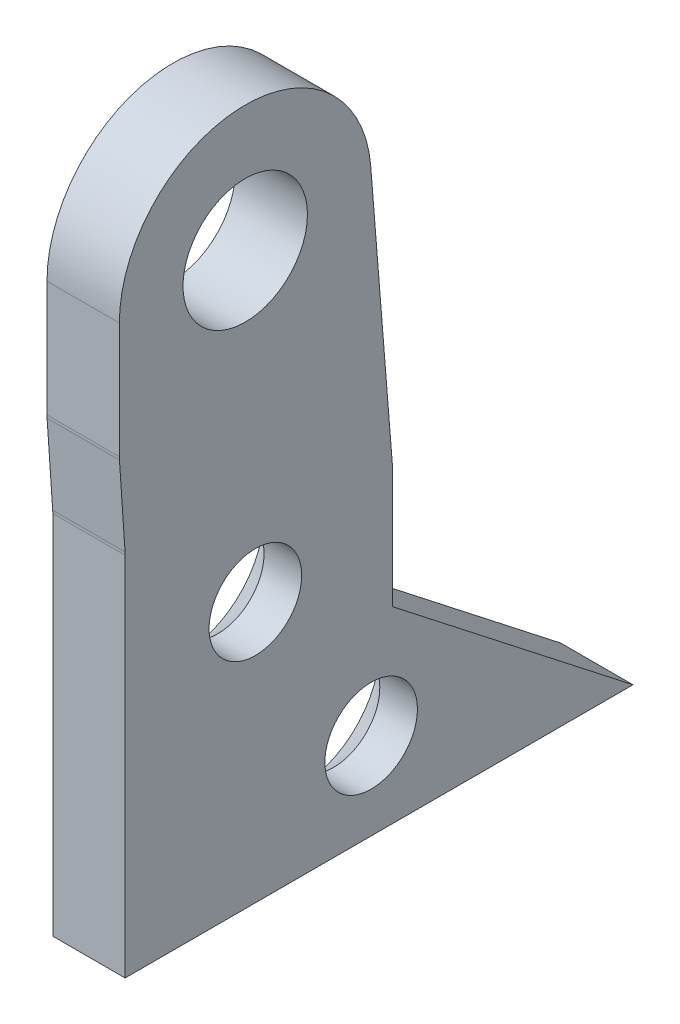
ISO-10303-21;
HEADER;
FILE_DESCRIPTION(('STEP AP214'),'2;1');
FILE_NAME('part.step','',(''),(''),'','','');
FILE_SCHEMA(('AUTOMOTIVE_DESIGN { 1 0 10303 214 1 1 1 1 }'));
ENDSEC;
DATA;
#1=APPLICATION_CONTEXT('core data for automotive mechanical design processes');
#2=APPLICATION_PROTOCOL_DEFINITION('international standard','automotive_design',2000,#1);
#3=PRODUCT_CONTEXT('',#1,'mechanical');
#4=PRODUCT('Part','Part','',(#3));
#5=PRODUCT_RELATED_PRODUCT_CATEGORY('part','',(#4));
#6=PRODUCT_DEFINITION_FORMATION('','',#4);
#7=PRODUCT_DEFINITION_CONTEXT('part definition',#1,'design');
#8=PRODUCT_DEFINITION('design','',#6,#7);
#9=PRODUCT_DEFINITION_SHAPE('','',#8);
#10=(LENGTH_UNIT() NAMED_UNIT(*) SI_UNIT(.MILLI.,.METRE.));
#11=(NAMED_UNIT(*) PLANE_ANGLE_UNIT() SI_UNIT($,.RADIAN.));
#12=(NAMED_UNIT(*) SI_UNIT($,.STERADIAN.) SOLID_ANGLE_UNIT());
#13=UNCERTAINTY_MEASURE_WITH_UNIT(LENGTH_MEASURE(1.E-05),#10,'distance_accuracy_value','');
#14=(GEOMETRIC_REPRESENTATION_CONTEXT(3) GLOBAL_UNCERTAINTY_ASSIGNED_CONTEXT((#13)) GLOBAL_UNIT_ASSIGNED_CONTEXT((#10,
#11,#12)) REPRESENTATION_CONTEXT('',''));
#15=CARTESIAN_POINT('',(0.,0.,0.));
#16=DIRECTION('',(0.,0.,1.));
#17=DIRECTION('',(1.,0.,0.));
#18=AXIS2_PLACEMENT_3D('',#15,#16,#17);
#19=CARTESIAN_POINT('',(-1.25,0.,0.));
#20=DIRECTION('',(-1.,0.,0.));
#21=DIRECTION('',(0.,0.,-1.));
#22=AXIS2_PLACEMENT_3D('',#19,#20,#21);
#23=PLANE('',#22);
#24=CARTESIAN_POINT('',(-1.25,-16.7,-4.35));
#25=DIRECTION('',(1.,0.,0.));
#26=DIRECTION('',(0.,0.,-1.));
#27=AXIS2_PLACEMENT_3D('',#24,#25,#26);
#28=CIRCLE('',#27,2.80000000000001);
#29=CARTESIAN_POINT('',(-1.25,-16.7,-7.15000000000001));
#30=VERTEX_POINT('',#29);
#31=EDGE_CURVE('E45',#30,#30,#28,.F.);
#32=ORIENTED_EDGE('',*,*,#31,.F.);
#33=EDGE_LOOP('',(#32));
#34=FACE_BOUND('',#33,.T.);
#35=CARTESIAN_POINT('',(-1.25,-10.7,-0.35));
#36=DIRECTION('',(1.,0.,0.));
#37=DIRECTION('',(0.,0.,-1.));
#38=AXIS2_PLACEMENT_3D('',#35,#36,#37);
#39=CIRCLE('',#38,2.80000000000001);
#40=CARTESIAN_POINT('',(-1.25,-10.7,-3.15000000000001));
#41=VERTEX_POINT('',#40);
#42=EDGE_CURVE('E166',#41,#41,#39,.F.);
#43=ORIENTED_EDGE('',*,*,#42,.F.);
#44=EDGE_LOOP('',(#43));
#45=FACE_BOUND('',#44,.T.);
#46=DIRECTION('',(0.,0.,1.));
#47=VECTOR('',#46,1.);
#48=CARTESIAN_POINT('',(-1.25,-19.7,4.15));
#49=LINE('',#48,#47);
#50=CARTESIAN_POINT('',(-1.25,-19.7,-13.3978945611621));
#51=VERTEX_POINT('',#50);
#52=CARTESIAN_POINT('',(-1.25,-19.7,4.15));
#53=VERTEX_POINT('',#52);
#54=EDGE_CURVE('E206',#51,#53,#49,.T.);
#55=ORIENTED_EDGE('',*,*,#54,.T.);
#56=DIRECTION('',(0.,-1.,0.));
#57=VECTOR('',#56,1.);
#58=CARTESIAN_POINT('',(-1.25,-7.05080295932135,4.15));
#59=LINE('',#58,#57);
#60=CARTESIAN_POINT('',(-1.25,-7.05080295932135,4.15));
#61=VERTEX_POINT('',#60);
#62=EDGE_CURVE('E130',#61,#53,#59,.T.);
#63=ORIENTED_EDGE('',*,*,#62,.F.);
#64=CARTESIAN_POINT('',(-1.25,-7.05080295932135,5.65));
#65=DIRECTION('',(-1.,0.,0.));
#66=DIRECTION('',(0.,0.,-1.));
#67=AXIS2_PLACEMENT_3D('',#64,#65,#66);
#68=CIRCLE('',#67,1.5);
#69=CARTESIAN_POINT('',(-1.25,-6.94931345773765,4.153437311347));
#70=VERTEX_POINT('',#69);
#71=EDGE_CURVE('E109',#70,#61,#68,.T.);
#72=ORIENTED_EDGE('',*,*,#71,.F.);
#73=DIRECTION('',(0.,-0.997708459101999,-0.0676596677224669));
#74=VECTOR('',#73,1.);
#75=CARTESIAN_POINT('',(-1.25,-4.1014895015837,4.346562688653));
#76=LINE('',#75,#74);
#77=CARTESIAN_POINT('',(-1.25,-4.1014895015837,4.346562688653));
#78=VERTEX_POINT('',#77);
#79=EDGE_CURVE('E120',#78,#70,#76,.T.);
#80=ORIENTED_EDGE('',*,*,#79,.F.);
#81=CARTESIAN_POINT('',(-1.25,-4.,2.85));
#82=DIRECTION('',(1.,0.,0.));
#83=DIRECTION('',(0.,0.,-1.));
#84=AXIS2_PLACEMENT_3D('',#81,#82,#83);
#85=CIRCLE('',#84,1.5);
#86=CARTESIAN_POINT('',(-1.25,-4.,4.35));
#87=VERTEX_POINT('',#86);
#88=EDGE_CURVE('E125',#87,#78,#85,.T.);
#89=ORIENTED_EDGE('',*,*,#88,.F.);
#90=DIRECTION('',(0.,-1.,0.));
#91=VECTOR('',#90,1.);
#92=CARTESIAN_POINT('',(-1.25,0.,4.35));
#93=LINE('',#92,#91);
#94=CARTESIAN_POINT('',(-1.25,0.,4.35));
#95=VERTEX_POINT('',#94);
#96=EDGE_CURVE('E231',#95,#87,#93,.T.);
#97=ORIENTED_EDGE('',*,*,#96,.F.);
#98=CARTESIAN_POINT('',(-1.25,0.,0.));
#99=DIRECTION('',(1.,0.,0.));
#100=DIRECTION('',(0.,0.,-1.));
#101=AXIS2_PLACEMENT_3D('',#98,#99,#100);
#102=CIRCLE('',#101,4.35);
#103=CARTESIAN_POINT('',(-1.25,0.348531342054637,-4.33601497963344));
#104=VERTEX_POINT('',#103);
#105=EDGE_CURVE('E156',#104,#95,#102,.T.);
#106=ORIENTED_EDGE('',*,*,#105,.F.);
#107=DIRECTION('',(0.,0.996785052789297,0.0801221475987673));
#108=VECTOR('',#107,1.);
#109=CARTESIAN_POINT('',(-1.25,-12.8120622960922,-5.39387095671929));
#110=LINE('',#109,#108);
#111=CARTESIAN_POINT('',(-1.25,-8.98239612653322,-5.08604021905647));
#112=VERTEX_POINT('',#111);
#113=EDGE_CURVE('E132',#112,#104,#110,.T.);
#114=ORIENTED_EDGE('',*,*,#113,.F.);
#115=DIRECTION('',(0.,-1.,0.));
#116=VECTOR('',#115,1.);
#117=CARTESIAN_POINT('',(-1.25,-13.2060676728955,-5.08604021905647));
#118=LINE('',#117,#116);
#119=CARTESIAN_POINT('',(-1.25,-13.2060676728955,-5.08604021905647));
#120=VERTEX_POINT('',#119);
#121=EDGE_CURVE('E194',#112,#120,#118,.T.);
#122=ORIENTED_EDGE('',*,*,#121,.T.);
#123=DIRECTION('',(0.,-0.615661475325654,-0.788010753606726));
#124=VECTOR('',#123,1.);
#125=CARTESIAN_POINT('',(-1.25,-19.7,-13.3978945611621));
#126=LINE('',#125,#124);
#127=EDGE_CURVE('E198',#120,#51,#126,.T.);
#128=ORIENTED_EDGE('',*,*,#127,.T.);
#129=EDGE_LOOP('',(#55,#63,#72,#80,#89,#97,#106,#114,#122,#128));
#130=FACE_BOUND('',#129,.T.);
#131=CARTESIAN_POINT('',(-1.25,0.,0.));
#132=DIRECTION('',(1.,0.,0.));
#133=DIRECTION('',(0.,0.,-1.));
#134=AXIS2_PLACEMENT_3D('',#131,#132,#133);
#135=CIRCLE('',#134,2.15);
#136=CARTESIAN_POINT('',(-1.25,0.,-2.15));
#137=VERTEX_POINT('',#136);
#138=EDGE_CURVE('E141',#137,#137,#135,.T.);
#139=ORIENTED_EDGE('',*,*,#138,.T.);
#140=EDGE_LOOP('',(#139));
#141=FACE_BOUND('',#140,.T.);
#142=ADVANCED_FACE('F37',(#34,#45,#130,#141),#23,.T.);
#143=CARTESIAN_POINT('',(1.25,0.,0.));
#144=DIRECTION('',(-1.,0.,0.));
#145=DIRECTION('',(0.,0.,-1.));
#146=AXIS2_PLACEMENT_3D('',#143,#144,#145);
#147=PLANE('',#146);
#148=CARTESIAN_POINT('',(1.25,-16.7,-4.35));
#149=DIRECTION('',(1.,0.,0.));
#150=DIRECTION('',(0.,0.,-1.));
#151=AXIS2_PLACEMENT_3D('',#148,#149,#150);
#152=CIRCLE('',#151,1.6);
#153=CARTESIAN_POINT('',(1.25,-16.7,-5.95));
#154=VERTEX_POINT('',#153);
#155=EDGE_CURVE('E195',#154,#154,#152,.T.);
#156=ORIENTED_EDGE('',*,*,#155,.F.);
#157=EDGE_LOOP('',(#156));
#158=FACE_BOUND('',#157,.T.);
#159=CARTESIAN_POINT('',(1.25,-10.7,-0.35));
#160=DIRECTION('',(1.,0.,0.));
#161=DIRECTION('',(0.,0.,-1.));
#162=AXIS2_PLACEMENT_3D('',#159,#160,#161);
#163=CIRCLE('',#162,1.6);
#164=CARTESIAN_POINT('',(1.25,-10.7,-1.95));
#165=VERTEX_POINT('',#164);
#166=EDGE_CURVE('E192',#165,#165,#163,.T.);
#167=ORIENTED_EDGE('',*,*,#166,.F.);
#168=EDGE_LOOP('',(#167));
#169=FACE_BOUND('',#168,.T.);
#170=DIRECTION('',(0.,-0.615661475325654,-0.788010753606726));
#171=VECTOR('',#170,1.);
#172=CARTESIAN_POINT('',(1.25,-19.7,-13.3978945611621));
#173=LINE('',#172,#171);
#174=CARTESIAN_POINT('',(1.25,-13.2060676728955,-5.08604021905647));
#175=VERTEX_POINT('',#174);
#176=CARTESIAN_POINT('',(1.25,-19.7,-13.3978945611621));
#177=VERTEX_POINT('',#176);
#178=EDGE_CURVE('E205',#175,#177,#173,.T.);
#179=ORIENTED_EDGE('',*,*,#178,.F.);
#180=DIRECTION('',(0.,-1.,0.));
#181=VECTOR('',#180,1.);
#182=CARTESIAN_POINT('',(1.25,-13.2060676728955,-5.08604021905647));
#183=LINE('',#182,#181);
#184=CARTESIAN_POINT('',(1.25,-8.98239612653322,-5.08604021905647));
#185=VERTEX_POINT('',#184);
#186=EDGE_CURVE('E203',#185,#175,#183,.T.);
#187=ORIENTED_EDGE('',*,*,#186,.F.);
#188=DIRECTION('',(0.,0.996785052789297,0.0801221475987673));
#189=VECTOR('',#188,1.);
#190=CARTESIAN_POINT('',(1.25,-12.8120622960922,-5.39387095671929));
#191=LINE('',#190,#189);
#192=CARTESIAN_POINT('',(1.25,0.348531342054637,-4.33601497963344));
#193=VERTEX_POINT('',#192);
#194=EDGE_CURVE('E153',#185,#193,#191,.T.);
#195=ORIENTED_EDGE('',*,*,#194,.T.);
#196=CARTESIAN_POINT('',(1.25,0.,0.));
#197=DIRECTION('',(1.,0.,0.));
#198=DIRECTION('',(0.,0.,-1.));
#199=AXIS2_PLACEMENT_3D('',#196,#197,#198);
#200=CIRCLE('',#199,4.35);
#201=CARTESIAN_POINT('',(1.25,0.,4.35));
#202=VERTEX_POINT('',#201);
#203=EDGE_CURVE('E137',#193,#202,#200,.T.);
#204=ORIENTED_EDGE('',*,*,#203,.T.);
#205=DIRECTION('',(0.,-1.,0.));
#206=VECTOR('',#205,1.);
#207=CARTESIAN_POINT('',(1.25,0.,4.35));
#208=LINE('',#207,#206);
#209=CARTESIAN_POINT('',(1.25,-4.,4.35));
#210=VERTEX_POINT('',#209);
#211=EDGE_CURVE('E140',#202,#210,#208,.T.);
#212=ORIENTED_EDGE('',*,*,#211,.T.);
#213=CARTESIAN_POINT('',(1.25,-4.,2.85));
#214=DIRECTION('',(1.,0.,0.));
#215=DIRECTION('',(0.,0.,-1.));
#216=AXIS2_PLACEMENT_3D('',#213,#214,#215);
#217=CIRCLE('',#216,1.5);
#218=CARTESIAN_POINT('',(1.25,-4.1014895015837,4.346562688653));
#219=VERTEX_POINT('',#218);
#220=EDGE_CURVE('E144',#210,#219,#217,.T.);
#221=ORIENTED_EDGE('',*,*,#220,.T.);
#222=DIRECTION('',(0.,-0.997708459101999,-0.0676596677224669));
#223=VECTOR('',#222,1.);
#224=CARTESIAN_POINT('',(1.25,-4.1014895015837,4.346562688653));
#225=LINE('',#224,#223);
#226=CARTESIAN_POINT('',(1.25,-6.94931345773765,4.153437311347));
#227=VERTEX_POINT('',#226);
#228=EDGE_CURVE('E147',#219,#227,#225,.T.);
#229=ORIENTED_EDGE('',*,*,#228,.T.);
#230=CARTESIAN_POINT('',(1.25,-7.05080295932135,5.65));
#231=DIRECTION('',(-1.,0.,0.));
#232=DIRECTION('',(0.,0.,-1.));
#233=AXIS2_PLACEMENT_3D('',#230,#231,#232);
#234=CIRCLE('',#233,1.5);
#235=CARTESIAN_POINT('',(1.25,-7.05080295932135,4.15));
#236=VERTEX_POINT('',#235);
#237=EDGE_CURVE('E112',#227,#236,#234,.T.);
#238=ORIENTED_EDGE('',*,*,#237,.T.);
#239=DIRECTION('',(0.,-1.,0.));
#240=VECTOR('',#239,1.);
#241=CARTESIAN_POINT('',(1.25,-7.05080295932135,4.15));
#242=LINE('',#241,#240);
#243=CARTESIAN_POINT('',(1.25,-19.7,4.15));
#244=VERTEX_POINT('',#243);
#245=EDGE_CURVE('E150',#236,#244,#242,.T.);
#246=ORIENTED_EDGE('',*,*,#245,.T.);
#247=DIRECTION('',(0.,0.,1.));
#248=VECTOR('',#247,1.);
#249=CARTESIAN_POINT('',(1.25,-19.7,4.15));
#250=LINE('',#249,#248);
#251=EDGE_CURVE('E209',#177,#244,#250,.T.);
#252=ORIENTED_EDGE('',*,*,#251,.F.);
#253=EDGE_LOOP('',(#179,#187,#195,#204,#212,#221,#229,#238,#246,#252));
#254=FACE_BOUND('',#253,.T.);
#255=CARTESIAN_POINT('',(1.25,0.,0.));
#256=DIRECTION('',(1.,0.,0.));
#257=DIRECTION('',(0.,0.,-1.));
#258=AXIS2_PLACEMENT_3D('',#255,#256,#257);
#259=CIRCLE('',#258,2.15);
#260=CARTESIAN_POINT('',(1.25,0.,-2.15));
#261=VERTEX_POINT('',#260);
#262=EDGE_CURVE('E218',#261,#261,#259,.T.);
#263=ORIENTED_EDGE('',*,*,#262,.F.);
#264=EDGE_LOOP('',(#263));
#265=FACE_BOUND('',#264,.T.);
#266=ADVANCED_FACE('F176',(#158,#169,#254,#265),#147,.F.);
#267=CARTESIAN_POINT('',(-1.25,0.,0.));
#268=DIRECTION('',(1.,0.,0.));
#269=DIRECTION('',(0.,0.,1.));
#270=AXIS2_PLACEMENT_3D('',#267,#268,#269);
#271=CYLINDRICAL_SURFACE('',#270,4.35);
#272=ORIENTED_EDGE('',*,*,#203,.F.);
#273=DIRECTION('',(1.,0.,0.));
#274=VECTOR('',#273,1.);
#275=CARTESIAN_POINT('',(-1.25,0.348531342054637,-4.33601497963344));
#276=LINE('',#275,#274);
#277=EDGE_CURVE('E61',#104,#193,#276,.T.);
#278=ORIENTED_EDGE('',*,*,#277,.F.);
#279=ORIENTED_EDGE('',*,*,#105,.T.);
#280=DIRECTION('',(1.,0.,0.));
#281=VECTOR('',#280,1.);
#282=CARTESIAN_POINT('',(-1.25,0.,4.35));
#283=LINE('',#282,#281);
#284=EDGE_CURVE('E92',#95,#202,#283,.T.);
#285=ORIENTED_EDGE('',*,*,#284,.T.);
#286=EDGE_LOOP('',(#272,#278,#279,#285));
#287=FACE_BOUND('',#286,.T.);
#288=ADVANCED_FACE('F243',(#287),#271,.T.);
#289=CARTESIAN_POINT('',(-1.25,0.,4.35));
#290=DIRECTION('',(0.,0.,-1.));
#291=DIRECTION('',(0.,1.,0.));
#292=AXIS2_PLACEMENT_3D('',#289,#290,#291);
#293=PLANE('',#292);
#294=ORIENTED_EDGE('',*,*,#211,.F.);
#295=ORIENTED_EDGE('',*,*,#284,.F.);
#296=ORIENTED_EDGE('',*,*,#96,.T.);
#297=DIRECTION('',(1.,0.,0.));
#298=VECTOR('',#297,1.);
#299=CARTESIAN_POINT('',(-1.25,-4.,4.35));
#300=LINE('',#299,#298);
#301=EDGE_CURVE('E160',#87,#210,#300,.T.);
#302=ORIENTED_EDGE('',*,*,#301,.T.);
#303=EDGE_LOOP('',(#294,#295,#296,#302));
#304=FACE_BOUND('',#303,.T.);
#305=ADVANCED_FACE('F238',(#304),#293,.F.);
#306=CARTESIAN_POINT('',(-1.25,-4.,2.85));
#307=DIRECTION('',(1.,0.,0.));
#308=DIRECTION('',(0.,0.,1.));
#309=AXIS2_PLACEMENT_3D('',#306,#307,#308);
#310=CYLINDRICAL_SURFACE('',#309,1.5);
#311=ORIENTED_EDGE('',*,*,#220,.F.);
#312=ORIENTED_EDGE('',*,*,#301,.F.);
#313=ORIENTED_EDGE('',*,*,#88,.T.);
#314=DIRECTION('',(1.,0.,0.));
#315=VECTOR('',#314,1.);
#316=CARTESIAN_POINT('',(-1.25,-4.1014895015837,4.346562688653));
#317=LINE('',#316,#315);
#318=EDGE_CURVE('E116',#78,#219,#317,.T.);
#319=ORIENTED_EDGE('',*,*,#318,.T.);
#320=EDGE_LOOP('',(#311,#312,#313,#319));
#321=FACE_BOUND('',#320,.T.);
#322=ADVANCED_FACE('F234',(#321),#310,.T.);
#323=CARTESIAN_POINT('',(-1.25,-4.1014895015837,4.346562688653));
#324=DIRECTION('',(0.,0.0676596677224669,-0.997708459101999));
#325=DIRECTION('',(0.,0.997708459101999,0.0676596677224669));
#326=AXIS2_PLACEMENT_3D('',#323,#324,#325);
#327=PLANE('',#326);
#328=ORIENTED_EDGE('',*,*,#228,.F.);
#329=ORIENTED_EDGE('',*,*,#318,.F.);
#330=ORIENTED_EDGE('',*,*,#79,.T.);
#331=DIRECTION('',(1.,0.,0.));
#332=VECTOR('',#331,1.);
#333=CARTESIAN_POINT('',(-1.25,-6.94931345773765,4.153437311347));
#334=LINE('',#333,#332);
#335=EDGE_CURVE('E105',#70,#227,#334,.T.);
#336=ORIENTED_EDGE('',*,*,#335,.T.);
#337=EDGE_LOOP('',(#328,#329,#330,#336));
#338=FACE_BOUND('',#337,.T.);
#339=ADVANCED_FACE('F121',(#338),#327,.F.);
#340=CARTESIAN_POINT('',(-1.25,-7.05080295932135,5.65));
#341=DIRECTION('',(1.,0.,0.));
#342=DIRECTION('',(0.,0.,1.));
#343=AXIS2_PLACEMENT_3D('',#340,#341,#342);
#344=CYLINDRICAL_SURFACE('',#343,1.5);
#345=ORIENTED_EDGE('',*,*,#237,.F.);
#346=ORIENTED_EDGE('',*,*,#335,.F.);
#347=ORIENTED_EDGE('',*,*,#71,.T.);
#348=DIRECTION('',(1.,0.,0.));
#349=VECTOR('',#348,1.);
#350=CARTESIAN_POINT('',(-1.25,-7.05080295932135,4.15));
#351=LINE('',#350,#349);
#352=EDGE_CURVE('E117',#61,#236,#351,.T.);
#353=ORIENTED_EDGE('',*,*,#352,.T.);
#354=EDGE_LOOP('',(#345,#346,#347,#353));
#355=FACE_BOUND('',#354,.T.);
#356=ADVANCED_FACE('F107',(#355),#344,.F.);
#357=CARTESIAN_POINT('',(-1.25,-7.05080295932135,4.15));
#358=DIRECTION('',(0.,0.,-1.));
#359=DIRECTION('',(0.,1.,0.));
#360=AXIS2_PLACEMENT_3D('',#357,#358,#359);
#361=PLANE('',#360);
#362=ORIENTED_EDGE('',*,*,#245,.F.);
#363=ORIENTED_EDGE('',*,*,#352,.F.);
#364=ORIENTED_EDGE('',*,*,#62,.T.);
#365=DIRECTION('',(-1.,0.,0.));
#366=VECTOR('',#365,1.);
#367=CARTESIAN_POINT('',(1.25,-19.7,4.15));
#368=LINE('',#367,#366);
#369=EDGE_CURVE('E215',#244,#53,#368,.T.);
#370=ORIENTED_EDGE('',*,*,#369,.F.);
#371=EDGE_LOOP('',(#362,#363,#364,#370));
#372=FACE_BOUND('',#371,.T.);
#373=ADVANCED_FACE('F282',(#372),#361,.F.);
#374=CARTESIAN_POINT('',(-1.25,-12.8120622960922,-5.39387095671929));
#375=DIRECTION('',(0.,-0.0801221475987673,0.996785052789297));
#376=DIRECTION('',(0.,-0.996785052789297,-0.0801221475987673));
#377=AXIS2_PLACEMENT_3D('',#374,#375,#376);
#378=PLANE('',#377);
#379=ORIENTED_EDGE('',*,*,#113,.T.);
#380=ORIENTED_EDGE('',*,*,#277,.T.);
#381=ORIENTED_EDGE('',*,*,#194,.F.);
#382=DIRECTION('',(-1.,0.,0.));
#383=VECTOR('',#382,1.);
#384=CARTESIAN_POINT('',(1.25,-8.98239612653322,-5.08604021905647));
#385=LINE('',#384,#383);
#386=EDGE_CURVE('E52',#185,#112,#385,.T.);
#387=ORIENTED_EDGE('',*,*,#386,.T.);
#388=EDGE_LOOP('',(#379,#380,#381,#387));
#389=FACE_BOUND('',#388,.T.);
#390=ADVANCED_FACE('F277',(#389),#378,.F.);
#391=CARTESIAN_POINT('',(-1.25,0.,0.));
#392=DIRECTION('',(1.,0.,0.));
#393=DIRECTION('',(0.,0.,1.));
#394=AXIS2_PLACEMENT_3D('',#391,#392,#393);
#395=CYLINDRICAL_SURFACE('',#394,2.15);
#396=ORIENTED_EDGE('',*,*,#138,.F.);
#397=EDGE_LOOP('',(#396));
#398=FACE_BOUND('',#397,.T.);
#399=ORIENTED_EDGE('',*,*,#262,.T.);
#400=EDGE_LOOP('',(#399));
#401=FACE_BOUND('',#400,.T.);
#402=ADVANCED_FACE('F269',(#398,#401),#395,.F.);
#403=CARTESIAN_POINT('',(1.25,-19.7,4.15));
#404=DIRECTION('',(0.,1.,0.));
#405=DIRECTION('',(0.,0.,1.));
#406=AXIS2_PLACEMENT_3D('',#403,#404,#405);
#407=PLANE('',#406);
#408=ORIENTED_EDGE('',*,*,#54,.F.);
#409=DIRECTION('',(-1.,0.,0.));
#410=VECTOR('',#409,1.);
#411=CARTESIAN_POINT('',(1.25,-19.7,-13.3978945611621));
#412=LINE('',#411,#410);
#413=EDGE_CURVE('E219',#177,#51,#412,.T.);
#414=ORIENTED_EDGE('',*,*,#413,.F.);
#415=ORIENTED_EDGE('',*,*,#251,.T.);
#416=ORIENTED_EDGE('',*,*,#369,.T.);
#417=EDGE_LOOP('',(#408,#414,#415,#416));
#418=FACE_BOUND('',#417,.T.);
#419=ADVANCED_FACE('F265',(#418),#407,.F.);
#420=CARTESIAN_POINT('',(1.25,-19.7,-13.3978945611621));
#421=DIRECTION('',(0.,-0.788010753606726,0.615661475325654));
#422=DIRECTION('',(0.,-0.615661475325654,-0.788010753606726));
#423=AXIS2_PLACEMENT_3D('',#420,#421,#422);
#424=PLANE('',#423);
#425=ORIENTED_EDGE('',*,*,#127,.F.);
#426=DIRECTION('',(-1.,0.,0.));
#427=VECTOR('',#426,1.);
#428=CARTESIAN_POINT('',(1.25,-13.2060676728955,-5.08604021905647));
#429=LINE('',#428,#427);
#430=EDGE_CURVE('E222',#175,#120,#429,.T.);
#431=ORIENTED_EDGE('',*,*,#430,.F.);
#432=ORIENTED_EDGE('',*,*,#178,.T.);
#433=ORIENTED_EDGE('',*,*,#413,.T.);
#434=EDGE_LOOP('',(#425,#431,#432,#433));
#435=FACE_BOUND('',#434,.T.);
#436=ADVANCED_FACE('F268',(#435),#424,.F.);
#437=CARTESIAN_POINT('',(1.25,-13.2060676728955,-5.08604021905647));
#438=DIRECTION('',(0.,0.,1.));
#439=DIRECTION('',(0.,-1.,0.));
#440=AXIS2_PLACEMENT_3D('',#437,#438,#439);
#441=PLANE('',#440);
#442=ORIENTED_EDGE('',*,*,#121,.F.);
#443=ORIENTED_EDGE('',*,*,#386,.F.);
#444=ORIENTED_EDGE('',*,*,#186,.T.);
#445=ORIENTED_EDGE('',*,*,#430,.T.);
#446=EDGE_LOOP('',(#442,#443,#444,#445));
#447=FACE_BOUND('',#446,.T.);
#448=ADVANCED_FACE('F188',(#447),#441,.F.);
#449=CARTESIAN_POINT('',(1.25,-10.7,-0.35));
#450=DIRECTION('',(-1.,0.,0.));
#451=DIRECTION('',(0.,0.,-1.));
#452=AXIS2_PLACEMENT_3D('',#449,#450,#451);
#453=CYLINDRICAL_SURFACE('',#452,1.6);
#454=CARTESIAN_POINT('',(-0.0499999999999986,-10.7,-0.35));
#455=DIRECTION('',(1.,0.,0.));
#456=DIRECTION('',(0.,0.,-1.));
#457=AXIS2_PLACEMENT_3D('',#454,#455,#456);
#458=CIRCLE('',#457,1.6);
#459=CARTESIAN_POINT('',(-0.0499999999999986,-10.7,-1.95));
#460=VERTEX_POINT('',#459);
#461=EDGE_CURVE('E11',#460,#460,#458,.T.);
#462=ORIENTED_EDGE('',*,*,#461,.F.);
#463=EDGE_LOOP('',(#462));
#464=FACE_BOUND('',#463,.T.);
#465=ORIENTED_EDGE('',*,*,#166,.T.);
#466=EDGE_LOOP('',(#465));
#467=FACE_BOUND('',#466,.T.);
#468=ADVANCED_FACE('F184',(#464,#467),#453,.F.);
#469=CARTESIAN_POINT('',(1.25,-16.7,-4.35));
#470=DIRECTION('',(-1.,0.,0.));
#471=DIRECTION('',(0.,0.,-1.));
#472=AXIS2_PLACEMENT_3D('',#469,#470,#471);
#473=CYLINDRICAL_SURFACE('',#472,1.6);
#474=CARTESIAN_POINT('',(-0.0499999999999993,-16.7,-4.35));
#475=DIRECTION('',(1.,0.,0.));
#476=DIRECTION('',(0.,0.,-1.));
#477=AXIS2_PLACEMENT_3D('',#474,#475,#476);
#478=CIRCLE('',#477,1.6);
#479=CARTESIAN_POINT('',(-0.0499999999999993,-16.7,-5.95));
#480=VERTEX_POINT('',#479);
#481=EDGE_CURVE('E163',#480,#480,#478,.T.);
#482=ORIENTED_EDGE('',*,*,#481,.F.);
#483=EDGE_LOOP('',(#482));
#484=FACE_BOUND('',#483,.T.);
#485=ORIENTED_EDGE('',*,*,#155,.T.);
#486=EDGE_LOOP('',(#485));
#487=FACE_BOUND('',#486,.T.);
#488=ADVANCED_FACE('F187',(#484,#487),#473,.F.);
#489=CARTESIAN_POINT('',(-0.0499999999999993,-16.7,-4.35));
#490=DIRECTION('',(-1.,0.,0.));
#491=DIRECTION('',(0.,0.,-1.));
#492=AXIS2_PLACEMENT_3D('',#489,#490,#491);
#493=CONICAL_SURFACE('',#492,1.6,0.78539816339745);
#494=ORIENTED_EDGE('',*,*,#31,.T.);
#495=EDGE_LOOP('',(#494));
#496=FACE_BOUND('',#495,.T.);
#497=ORIENTED_EDGE('',*,*,#481,.T.);
#498=EDGE_LOOP('',(#497));
#499=FACE_BOUND('',#498,.T.);
#500=ADVANCED_FACE('F171',(#496,#499),#493,.F.);
#501=CARTESIAN_POINT('',(-0.0499999999999986,-10.7,-0.35));
#502=DIRECTION('',(-1.,0.,0.));
#503=DIRECTION('',(0.,0.,-1.));
#504=AXIS2_PLACEMENT_3D('',#501,#502,#503);
#505=CONICAL_SURFACE('',#504,1.6,0.78539816339745);
#506=ORIENTED_EDGE('',*,*,#42,.T.);
#507=EDGE_LOOP('',(#506));
#508=FACE_BOUND('',#507,.T.);
#509=ORIENTED_EDGE('',*,*,#461,.T.);
#510=EDGE_LOOP('',(#509));
#511=FACE_BOUND('',#510,.T.);
#512=ADVANCED_FACE('F39',(#508,#511),#505,.F.);
#513=CLOSED_SHELL('',(#142,#266,#288,#305,#322,#339,#356,#373,#390,#402,#419,#436,#448,#468,
#488,#500,#512));
#514=MANIFOLD_SOLID_BREP('B2',#513);
#515=ADVANCED_BREP_SHAPE_REPRESENTATION('',(#18,#514),#14);
#516=SHAPE_DEFINITION_REPRESENTATION(#9,#515);
ENDSEC;
END-ISO-10303-21;
